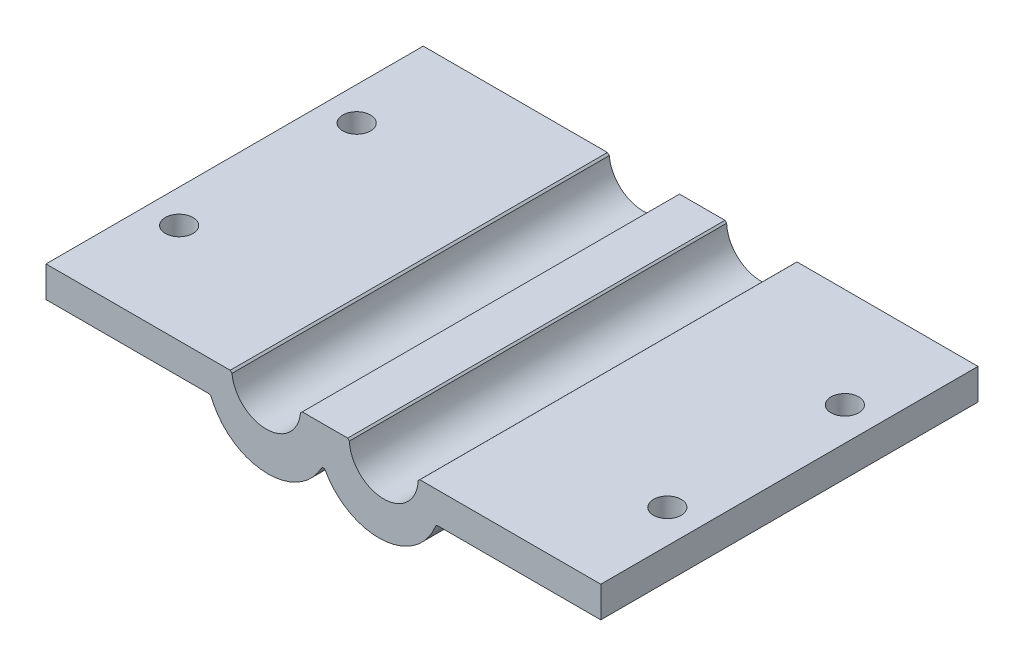
ISO-10303-21;
HEADER;
FILE_DESCRIPTION(('STEP AP214'),'2;1');
FILE_NAME('part.step','',(''),(''),'','','');
FILE_SCHEMA(('AUTOMOTIVE_DESIGN { 1 0 10303 214 1 1 1 1 }'));
ENDSEC;
DATA;
#1=APPLICATION_CONTEXT('core data for automotive mechanical design processes');
#2=APPLICATION_PROTOCOL_DEFINITION('international standard','automotive_design',2000,#1);
#3=PRODUCT_CONTEXT('',#1,'mechanical');
#4=PRODUCT('Part','Part','',(#3));
#5=PRODUCT_RELATED_PRODUCT_CATEGORY('part','',(#4));
#6=PRODUCT_DEFINITION_FORMATION('','',#4);
#7=PRODUCT_DEFINITION_CONTEXT('part definition',#1,'design');
#8=PRODUCT_DEFINITION('design','',#6,#7);
#9=PRODUCT_DEFINITION_SHAPE('','',#8);
#10=(LENGTH_UNIT() NAMED_UNIT(*) SI_UNIT(.MILLI.,.METRE.));
#11=(NAMED_UNIT(*) PLANE_ANGLE_UNIT() SI_UNIT($,.RADIAN.));
#12=(NAMED_UNIT(*) SI_UNIT($,.STERADIAN.) SOLID_ANGLE_UNIT());
#13=UNCERTAINTY_MEASURE_WITH_UNIT(LENGTH_MEASURE(1.E-05),#10,'distance_accuracy_value','');
#14=(GEOMETRIC_REPRESENTATION_CONTEXT(3) GLOBAL_UNCERTAINTY_ASSIGNED_CONTEXT((#13)) GLOBAL_UNIT_ASSIGNED_CONTEXT((#10,
#11,#12)) REPRESENTATION_CONTEXT('',''));
#15=CARTESIAN_POINT('',(0.,0.,0.));
#16=DIRECTION('',(0.,0.,1.));
#17=DIRECTION('',(1.,0.,0.));
#18=AXIS2_PLACEMENT_3D('',#15,#16,#17);
#19=CARTESIAN_POINT('',(-25.,3.,17.));
#20=DIRECTION('',(0.,0.,-1.));
#21=DIRECTION('',(-1.,0.,0.));
#22=AXIS2_PLACEMENT_3D('',#19,#20,#21);
#23=PLANE('',#22);
#24=CARTESIAN_POINT('',(-5.14997765062478,2.91454889852003,17.));
#25=DIRECTION('',(0.,0.,-1.));
#26=DIRECTION('',(-1.,0.,0.));
#27=AXIS2_PLACEMENT_3D('',#24,#25,#26);
#28=CIRCLE('',#27,3.1);
#29=CARTESIAN_POINT('',(-2.06342243598436,2.62614482958895,17.));
#30=VERTEX_POINT('',#29);
#31=CARTESIAN_POINT('',(-8.23653286526521,2.62614482958897,17.));
#32=VERTEX_POINT('',#31);
#33=EDGE_CURVE('E271',#30,#32,#28,.T.);
#34=ORIENTED_EDGE('',*,*,#33,.T.);
#35=DIRECTION('',(-0.70710678118657,0.707106781186525,0.));
#36=VECTOR('',#35,1.);
#37=CARTESIAN_POINT('',(-8.23653286526521,2.62614482958897,17.));
#38=LINE('',#37,#36);
#39=CARTESIAN_POINT('',(-8.39735102760725,2.786962991931,17.));
#40=VERTEX_POINT('',#39);
#41=EDGE_CURVE('E314',#32,#40,#38,.T.);
#42=ORIENTED_EDGE('',*,*,#41,.T.);
#43=DIRECTION('',(-1.,0.,0.));
#44=VECTOR('',#43,1.);
#45=CARTESIAN_POINT('',(-25.,2.786962991931,17.));
#46=LINE('',#45,#44);
#47=CARTESIAN_POINT('',(-25.,2.786962991931,17.));
#48=VERTEX_POINT('',#47);
#49=EDGE_CURVE('E343',#40,#48,#46,.T.);
#50=ORIENTED_EDGE('',*,*,#49,.T.);
#51=DIRECTION('',(0.,-1.,0.));
#52=VECTOR('',#51,1.);
#53=CARTESIAN_POINT('',(-25.,3.,17.));
#54=LINE('',#53,#52);
#55=CARTESIAN_POINT('',(-25.,0.,17.));
#56=VERTEX_POINT('',#55);
#57=EDGE_CURVE('E228',#48,#56,#54,.T.);
#58=ORIENTED_EDGE('',*,*,#57,.T.);
#59=DIRECTION('',(1.,0.,0.));
#60=VECTOR('',#59,1.);
#61=CARTESIAN_POINT('',(-25.,0.,17.));
#62=LINE('',#61,#60);
#63=CARTESIAN_POINT('',(-10.3006575169956,0.,17.));
#64=VERTEX_POINT('',#63);
#65=EDGE_CURVE('E217',#56,#64,#62,.T.);
#66=ORIENTED_EDGE('',*,*,#65,.T.);
#67=CARTESIAN_POINT('',(-10.3006575169956,-0.2,17.));
#68=DIRECTION('',(0.,0.,-1.));
#69=DIRECTION('',(-1.,0.,0.));
#70=AXIS2_PLACEMENT_3D('',#67,#68,#69);
#71=CIRCLE('',#70,0.2);
#72=CARTESIAN_POINT('',(-10.1146695339431,-0.126457698159005,17.));
#73=VERTEX_POINT('',#72);
#74=EDGE_CURVE('E227',#64,#73,#71,.T.);
#75=ORIENTED_EDGE('',*,*,#74,.T.);
#76=CARTESIAN_POINT('',(-5.,1.89595560246837,17.));
#77=DIRECTION('',(0.,0.,1.));
#78=DIRECTION('',(-1.,0.,0.));
#79=AXIS2_PLACEMENT_3D('',#76,#77,#78);
#80=CIRCLE('',#79,5.5);
#81=CARTESIAN_POINT('',(-0.175438596491227,-0.744803239942928,17.));
#82=VERTEX_POINT('',#81);
#83=EDGE_CURVE('E259',#73,#82,#80,.T.);
#84=ORIENTED_EDGE('',*,*,#83,.T.);
#85=CARTESIAN_POINT('',(0.,-0.840830834212431,17.));
#86=DIRECTION('',(0.,0.,-1.));
#87=DIRECTION('',(-1.,0.,0.));
#88=AXIS2_PLACEMENT_3D('',#85,#86,#87);
#89=CIRCLE('',#88,0.2);
#90=CARTESIAN_POINT('',(0.175438596491228,-0.744803239942929,17.));
#91=VERTEX_POINT('',#90);
#92=EDGE_CURVE('E255',#82,#91,#89,.T.);
#93=ORIENTED_EDGE('',*,*,#92,.T.);
#94=CARTESIAN_POINT('',(5.,1.89595560246837,17.));
#95=DIRECTION('',(0.,0.,1.));
#96=DIRECTION('',(1.,0.,0.));
#97=AXIS2_PLACEMENT_3D('',#94,#95,#96);
#98=CIRCLE('',#97,5.5);
#99=CARTESIAN_POINT('',(10.1146695339431,-0.126457698159005,17.));
#100=VERTEX_POINT('',#99);
#101=EDGE_CURVE('E258',#91,#100,#98,.T.);
#102=ORIENTED_EDGE('',*,*,#101,.T.);
#103=CARTESIAN_POINT('',(10.3006575169956,-0.2,17.));
#104=DIRECTION('',(0.,0.,-1.));
#105=DIRECTION('',(-1.,0.,0.));
#106=AXIS2_PLACEMENT_3D('',#103,#104,#105);
#107=CIRCLE('',#106,0.2);
#108=CARTESIAN_POINT('',(10.3006575169956,0.,17.));
#109=VERTEX_POINT('',#108);
#110=EDGE_CURVE('E215',#100,#109,#107,.T.);
#111=ORIENTED_EDGE('',*,*,#110,.T.);
#112=CARTESIAN_POINT('',(25.,0.,17.));
#113=VERTEX_POINT('',#112);
#114=EDGE_CURVE('E209',#109,#113,#62,.T.);
#115=ORIENTED_EDGE('',*,*,#114,.T.);
#116=DIRECTION('',(0.,-1.,0.));
#117=VECTOR('',#116,1.);
#118=CARTESIAN_POINT('',(25.,3.,17.));
#119=LINE('',#118,#117);
#120=CARTESIAN_POINT('',(25.,2.786962991931,17.));
#121=VERTEX_POINT('',#120);
#122=EDGE_CURVE('E220',#121,#113,#119,.T.);
#123=ORIENTED_EDGE('',*,*,#122,.F.);
#124=CARTESIAN_POINT('',(8.68962068870659,2.786962991931,17.));
#125=VERTEX_POINT('',#124);
#126=EDGE_CURVE('E190',#121,#125,#46,.T.);
#127=ORIENTED_EDGE('',*,*,#126,.T.);
#128=DIRECTION('',(0.720228376692277,0.693737043415737,0.));
#129=VECTOR('',#128,1.);
#130=CARTESIAN_POINT('',(8.53972595731741,2.64258166630884,17.));
#131=LINE('',#130,#129);
#132=CARTESIAN_POINT('',(8.53972595731741,2.64258166630884,17.));
#133=VERTEX_POINT('',#132);
#134=EDGE_CURVE('E312',#125,#133,#131,.F.);
#135=ORIENTED_EDGE('',*,*,#134,.T.);
#136=CARTESIAN_POINT('',(5.44190150860759,2.75870093678417,17.));
#137=DIRECTION('',(0.,0.,-1.));
#138=DIRECTION('',(-1.,0.,0.));
#139=AXIS2_PLACEMENT_3D('',#136,#137,#138);
#140=CIRCLE('',#139,3.1);
#141=CARTESIAN_POINT('',(2.3443862604072,2.63460707244737,17.));
#142=VERTEX_POINT('',#141);
#143=EDGE_CURVE('E274',#133,#142,#140,.T.);
#144=ORIENTED_EDGE('',*,*,#143,.T.);
#145=DIRECTION('',(-0.707106781186572,0.707106781186523,0.));
#146=VECTOR('',#145,1.);
#147=CARTESIAN_POINT('',(2.3443862604072,2.63460707244736,17.));
#148=LINE('',#147,#146);
#149=CARTESIAN_POINT('',(2.19203034092355,2.786962991931,17.));
#150=VERTEX_POINT('',#149);
#151=EDGE_CURVE('E310',#142,#150,#148,.T.);
#152=ORIENTED_EDGE('',*,*,#151,.T.);
#153=CARTESIAN_POINT('',(-1.9026042736423,2.786962991931,17.));
#154=VERTEX_POINT('',#153);
#155=EDGE_CURVE('E337',#150,#154,#46,.T.);
#156=ORIENTED_EDGE('',*,*,#155,.T.);
#157=DIRECTION('',(0.707106781186553,0.707106781186542,0.));
#158=VECTOR('',#157,1.);
#159=CARTESIAN_POINT('',(-2.06342243598436,2.62614482958895,17.));
#160=LINE('',#159,#158);
#161=EDGE_CURVE('E308',#154,#30,#160,.F.);
#162=ORIENTED_EDGE('',*,*,#161,.T.);
#163=EDGE_LOOP('',(#34,#42,#50,#58,#66,#75,#84,#93,#102,#111,#115,#123,#127,#135,#144,#152,#156,#162));
#164=FACE_BOUND('',#163,.T.);
#165=ADVANCED_FACE('F36',(#164),#23,.F.);
#166=CARTESIAN_POINT('',(-25.,3.,-17.));
#167=DIRECTION('',(0.,0.,1.));
#168=DIRECTION('',(1.,0.,0.));
#169=AXIS2_PLACEMENT_3D('',#166,#167,#168);
#170=PLANE('',#169);
#171=DIRECTION('',(-1.,0.,0.));
#172=VECTOR('',#171,1.);
#173=CARTESIAN_POINT('',(-25.,2.786962991931,-17.));
#174=LINE('',#173,#172);
#175=CARTESIAN_POINT('',(-8.39735102760726,2.78696299193101,-17.));
#176=VERTEX_POINT('',#175);
#177=CARTESIAN_POINT('',(-25.,2.786962991931,-17.));
#178=VERTEX_POINT('',#177);
#179=EDGE_CURVE('E203',#176,#178,#174,.T.);
#180=ORIENTED_EDGE('',*,*,#179,.F.);
#181=DIRECTION('',(0.70710678118657,-0.707106781186525,0.));
#182=VECTOR('',#181,1.);
#183=CARTESIAN_POINT('',(-8.23653286526521,2.62614482958897,-17.));
#184=LINE('',#183,#182);
#185=CARTESIAN_POINT('',(-8.23653286526521,2.62614482958897,-17.));
#186=VERTEX_POINT('',#185);
#187=EDGE_CURVE('E322',#176,#186,#184,.T.);
#188=ORIENTED_EDGE('',*,*,#187,.T.);
#189=CARTESIAN_POINT('',(-5.14997765062478,2.91454889852003,-17.));
#190=DIRECTION('',(0.,0.,-1.));
#191=DIRECTION('',(-1.,0.,0.));
#192=AXIS2_PLACEMENT_3D('',#189,#190,#191);
#193=CIRCLE('',#192,3.1);
#194=CARTESIAN_POINT('',(-2.06342243598436,2.62614482958895,-17.));
#195=VERTEX_POINT('',#194);
#196=EDGE_CURVE('E281',#195,#186,#193,.T.);
#197=ORIENTED_EDGE('',*,*,#196,.F.);
#198=DIRECTION('',(-0.707106781186553,-0.707106781186542,0.));
#199=VECTOR('',#198,1.);
#200=CARTESIAN_POINT('',(-2.06342243598436,2.62614482958895,-17.));
#201=LINE('',#200,#199);
#202=CARTESIAN_POINT('',(-1.9026042736423,2.786962991931,-17.));
#203=VERTEX_POINT('',#202);
#204=EDGE_CURVE('E318',#195,#203,#201,.F.);
#205=ORIENTED_EDGE('',*,*,#204,.T.);
#206=CARTESIAN_POINT('',(2.19203034092355,2.786962991931,-17.));
#207=VERTEX_POINT('',#206);
#208=EDGE_CURVE('E201',#207,#203,#174,.T.);
#209=ORIENTED_EDGE('',*,*,#208,.F.);
#210=DIRECTION('',(0.707106781186572,-0.707106781186523,0.));
#211=VECTOR('',#210,1.);
#212=CARTESIAN_POINT('',(2.3443862604072,2.63460707244736,-17.));
#213=LINE('',#212,#211);
#214=CARTESIAN_POINT('',(2.3443862604072,2.63460707244737,-17.));
#215=VERTEX_POINT('',#214);
#216=EDGE_CURVE('E57',#207,#215,#213,.T.);
#217=ORIENTED_EDGE('',*,*,#216,.T.);
#218=CARTESIAN_POINT('',(5.44190150860759,2.75870093678417,-17.));
#219=DIRECTION('',(0.,0.,-1.));
#220=DIRECTION('',(-1.,0.,0.));
#221=AXIS2_PLACEMENT_3D('',#218,#219,#220);
#222=CIRCLE('',#221,3.1);
#223=CARTESIAN_POINT('',(8.53972595731741,2.64258166630884,-17.));
#224=VERTEX_POINT('',#223);
#225=EDGE_CURVE('E278',#224,#215,#222,.T.);
#226=ORIENTED_EDGE('',*,*,#225,.F.);
#227=DIRECTION('',(-0.720228376692277,-0.693737043415737,0.));
#228=VECTOR('',#227,1.);
#229=CARTESIAN_POINT('',(8.53972595731741,2.64258166630884,-17.));
#230=LINE('',#229,#228);
#231=CARTESIAN_POINT('',(8.68962068870659,2.786962991931,-17.));
#232=VERTEX_POINT('',#231);
#233=EDGE_CURVE('E51',#224,#232,#230,.F.);
#234=ORIENTED_EDGE('',*,*,#233,.T.);
#235=CARTESIAN_POINT('',(25.,2.786962991931,-17.));
#236=VERTEX_POINT('',#235);
#237=EDGE_CURVE('E187',#236,#232,#174,.T.);
#238=ORIENTED_EDGE('',*,*,#237,.F.);
#239=DIRECTION('',(0.,-1.,0.));
#240=VECTOR('',#239,1.);
#241=CARTESIAN_POINT('',(25.,3.,-17.));
#242=LINE('',#241,#240);
#243=CARTESIAN_POINT('',(25.,0.,-17.));
#244=VERTEX_POINT('',#243);
#245=EDGE_CURVE('E199',#236,#244,#242,.T.);
#246=ORIENTED_EDGE('',*,*,#245,.T.);
#247=DIRECTION('',(-1.,0.,0.));
#248=VECTOR('',#247,1.);
#249=CARTESIAN_POINT('',(-25.,0.,-17.));
#250=LINE('',#249,#248);
#251=CARTESIAN_POINT('',(10.3006575169956,0.,-17.));
#252=VERTEX_POINT('',#251);
#253=EDGE_CURVE('E208',#244,#252,#250,.T.);
#254=ORIENTED_EDGE('',*,*,#253,.T.);
#255=CARTESIAN_POINT('',(10.3006575169956,-0.2,-17.));
#256=DIRECTION('',(0.,0.,1.));
#257=DIRECTION('',(1.,0.,0.));
#258=AXIS2_PLACEMENT_3D('',#255,#256,#257);
#259=CIRCLE('',#258,0.2);
#260=CARTESIAN_POINT('',(10.1146695339431,-0.126457698159005,-17.));
#261=VERTEX_POINT('',#260);
#262=EDGE_CURVE('E211',#252,#261,#259,.T.);
#263=ORIENTED_EDGE('',*,*,#262,.T.);
#264=CARTESIAN_POINT('',(5.,1.89595560246837,-17.));
#265=DIRECTION('',(0.,0.,1.));
#266=DIRECTION('',(1.,0.,0.));
#267=AXIS2_PLACEMENT_3D('',#264,#265,#266);
#268=CIRCLE('',#267,5.5);
#269=CARTESIAN_POINT('',(0.175438596491228,-0.744803239942929,-17.));
#270=VERTEX_POINT('',#269);
#271=EDGE_CURVE('E263',#261,#270,#268,.F.);
#272=ORIENTED_EDGE('',*,*,#271,.T.);
#273=CARTESIAN_POINT('',(0.,-0.840830834212431,-17.));
#274=DIRECTION('',(0.,0.,1.));
#275=DIRECTION('',(1.,0.,0.));
#276=AXIS2_PLACEMENT_3D('',#273,#274,#275);
#277=CIRCLE('',#276,0.2);
#278=CARTESIAN_POINT('',(-0.175438596491227,-0.744803239942928,-17.));
#279=VERTEX_POINT('',#278);
#280=EDGE_CURVE('E265',#270,#279,#277,.T.);
#281=ORIENTED_EDGE('',*,*,#280,.T.);
#282=CARTESIAN_POINT('',(-5.,1.89595560246837,-17.));
#283=DIRECTION('',(0.,0.,1.));
#284=DIRECTION('',(1.,0.,0.));
#285=AXIS2_PLACEMENT_3D('',#282,#283,#284);
#286=CIRCLE('',#285,5.5);
#287=CARTESIAN_POINT('',(-10.1146695339431,-0.126457698159005,-17.));
#288=VERTEX_POINT('',#287);
#289=EDGE_CURVE('E267',#279,#288,#286,.F.);
#290=ORIENTED_EDGE('',*,*,#289,.T.);
#291=CARTESIAN_POINT('',(-10.3006575169956,-0.2,-17.));
#292=DIRECTION('',(0.,0.,1.));
#293=DIRECTION('',(1.,0.,0.));
#294=AXIS2_PLACEMENT_3D('',#291,#292,#293);
#295=CIRCLE('',#294,0.2);
#296=CARTESIAN_POINT('',(-10.3006575169956,0.,-17.));
#297=VERTEX_POINT('',#296);
#298=EDGE_CURVE('E270',#288,#297,#295,.T.);
#299=ORIENTED_EDGE('',*,*,#298,.T.);
#300=CARTESIAN_POINT('',(-25.,0.,-17.));
#301=VERTEX_POINT('',#300);
#302=EDGE_CURVE('E213',#297,#301,#250,.T.);
#303=ORIENTED_EDGE('',*,*,#302,.T.);
#304=DIRECTION('',(0.,-1.,0.));
#305=VECTOR('',#304,1.);
#306=CARTESIAN_POINT('',(-25.,3.,-17.));
#307=LINE('',#306,#305);
#308=EDGE_CURVE('E222',#178,#301,#307,.T.);
#309=ORIENTED_EDGE('',*,*,#308,.F.);
#310=EDGE_LOOP('',(#180,#188,#197,#205,#209,#217,#226,#234,#238,#246,#254,#263,#272,#281,#290,
#299,#303,#309));
#311=FACE_BOUND('',#310,.T.);
#312=ADVANCED_FACE('F197',(#311),#170,.F.);
#313=CARTESIAN_POINT('',(0.,-0.840830834212431,-37.642815516187));
#314=DIRECTION('',(0.,0.,1.));
#315=DIRECTION('',(1.,0.,0.));
#316=AXIS2_PLACEMENT_3D('',#313,#314,#315);
#317=CYLINDRICAL_SURFACE('',#316,0.2);
#318=CARTESIAN_POINT('',(0.,-0.840830834212431,3.5));
#319=DIRECTION('',(0.,0.,1.));
#320=DIRECTION('',(0.,-1.,0.));
#321=AXIS2_PLACEMENT_3D('',#318,#319,#320);
#322=CIRCLE('',#321,0.2);
#323=CARTESIAN_POINT('',(0.175438596491228,-0.744803239942929,3.5));
#324=VERTEX_POINT('',#323);
#325=CARTESIAN_POINT('',(-0.175438596491227,-0.744803239942928,3.5));
#326=VERTEX_POINT('',#325);
#327=EDGE_CURVE('E285',#324,#326,#322,.T.);
#328=ORIENTED_EDGE('',*,*,#327,.F.);
#329=DIRECTION('',(0.,0.,1.));
#330=VECTOR('',#329,1.);
#331=CARTESIAN_POINT('',(0.175438596491228,-0.744803239942929,-37.642815516187));
#332=LINE('',#331,#330);
#333=EDGE_CURVE('E236',#324,#91,#332,.T.);
#334=ORIENTED_EDGE('',*,*,#333,.T.);
#335=ORIENTED_EDGE('',*,*,#92,.F.);
#336=DIRECTION('',(0.,0.,1.));
#337=VECTOR('',#336,1.);
#338=CARTESIAN_POINT('',(-0.175438596491227,-0.744803239942928,-37.642815516187));
#339=LINE('',#338,#337);
#340=EDGE_CURVE('E249',#326,#82,#339,.T.);
#341=ORIENTED_EDGE('',*,*,#340,.F.);
#342=EDGE_LOOP('',(#328,#334,#335,#341));
#343=FACE_BOUND('',#342,.T.);
#344=ADVANCED_FACE('F423',(#343),#317,.F.);
#345=CARTESIAN_POINT('',(0.,0.,0.));
#346=DIRECTION('',(0.,1.,0.));
#347=DIRECTION('',(0.,0.,1.));
#348=AXIS2_PLACEMENT_3D('',#345,#346,#347);
#349=PLANE('',#348);
#350=CARTESIAN_POINT('',(22.,0.,-8.));
#351=DIRECTION('',(0.,1.,0.));
#352=DIRECTION('',(0.,0.,1.));
#353=AXIS2_PLACEMENT_3D('',#350,#351,#352);
#354=CIRCLE('',#353,1.25);
#355=CARTESIAN_POINT('',(22.,0.,-6.75));
#356=VERTEX_POINT('',#355);
#357=EDGE_CURVE('E232',#356,#356,#354,.T.);
#358=ORIENTED_EDGE('',*,*,#357,.T.);
#359=EDGE_LOOP('',(#358));
#360=FACE_BOUND('',#359,.T.);
#361=CARTESIAN_POINT('',(22.,0.,8.));
#362=DIRECTION('',(0.,1.,0.));
#363=DIRECTION('',(0.,0.,-1.));
#364=AXIS2_PLACEMENT_3D('',#361,#362,#363);
#365=CIRCLE('',#364,1.25);
#366=CARTESIAN_POINT('',(22.,0.,6.75));
#367=VERTEX_POINT('',#366);
#368=EDGE_CURVE('E235',#367,#367,#365,.T.);
#369=ORIENTED_EDGE('',*,*,#368,.T.);
#370=EDGE_LOOP('',(#369));
#371=FACE_BOUND('',#370,.T.);
#372=ORIENTED_EDGE('',*,*,#114,.F.);
#373=DIRECTION('',(0.,0.,1.));
#374=VECTOR('',#373,1.);
#375=CARTESIAN_POINT('',(10.3006575169956,0.,0.));
#376=LINE('',#375,#374);
#377=EDGE_CURVE('E231',#109,#252,#376,.F.);
#378=ORIENTED_EDGE('',*,*,#377,.T.);
#379=ORIENTED_EDGE('',*,*,#253,.F.);
#380=DIRECTION('',(0.,0.,-1.));
#381=VECTOR('',#380,1.);
#382=CARTESIAN_POINT('',(25.,0.,-17.));
#383=LINE('',#382,#381);
#384=EDGE_CURVE('E206',#113,#244,#383,.T.);
#385=ORIENTED_EDGE('',*,*,#384,.F.);
#386=EDGE_LOOP('',(#372,#378,#379,#385));
#387=FACE_BOUND('',#386,.T.);
#388=ADVANCED_FACE('F493',(#360,#371,#387),#349,.F.);
#389=CARTESIAN_POINT('',(-25.,3.,-17.));
#390=DIRECTION('',(1.,0.,0.));
#391=DIRECTION('',(0.,0.,-1.));
#392=AXIS2_PLACEMENT_3D('',#389,#390,#391);
#393=PLANE('',#392);
#394=ORIENTED_EDGE('',*,*,#57,.F.);
#395=DIRECTION('',(0.,0.,-1.));
#396=VECTOR('',#395,1.);
#397=CARTESIAN_POINT('',(-25.,2.786962991931,17.00005));
#398=LINE('',#397,#396);
#399=EDGE_CURVE('E194',#48,#178,#398,.T.);
#400=ORIENTED_EDGE('',*,*,#399,.T.);
#401=ORIENTED_EDGE('',*,*,#308,.T.);
#402=DIRECTION('',(0.,0.,1.));
#403=VECTOR('',#402,1.);
#404=CARTESIAN_POINT('',(-25.,0.,-17.));
#405=LINE('',#404,#403);
#406=EDGE_CURVE('E223',#301,#56,#405,.T.);
#407=ORIENTED_EDGE('',*,*,#406,.T.);
#408=EDGE_LOOP('',(#394,#400,#401,#407));
#409=FACE_BOUND('',#408,.T.);
#410=ADVANCED_FACE('F369',(#409),#393,.F.);
#411=CARTESIAN_POINT('',(25.,3.,-17.));
#412=DIRECTION('',(-1.,0.,0.));
#413=DIRECTION('',(0.,0.,1.));
#414=AXIS2_PLACEMENT_3D('',#411,#412,#413);
#415=PLANE('',#414);
#416=ORIENTED_EDGE('',*,*,#245,.F.);
#417=DIRECTION('',(0.,0.,-1.));
#418=VECTOR('',#417,1.);
#419=CARTESIAN_POINT('',(25.,2.786962991931,17.00005));
#420=LINE('',#419,#418);
#421=EDGE_CURVE('E184',#121,#236,#420,.T.);
#422=ORIENTED_EDGE('',*,*,#421,.F.);
#423=ORIENTED_EDGE('',*,*,#122,.T.);
#424=ORIENTED_EDGE('',*,*,#384,.T.);
#425=EDGE_LOOP('',(#416,#422,#423,#424));
#426=FACE_BOUND('',#425,.T.);
#427=ADVANCED_FACE('F204',(#426),#415,.F.);
#428=CARTESIAN_POINT('',(-22.,0.,-8.));
#429=DIRECTION('',(0.,1.,0.));
#430=DIRECTION('',(0.,0.,-1.));
#431=AXIS2_PLACEMENT_3D('',#428,#429,#430);
#432=CIRCLE('',#431,1.25);
#433=CARTESIAN_POINT('',(-22.,0.,-9.25));
#434=VERTEX_POINT('',#433);
#435=EDGE_CURVE('E243',#434,#434,#432,.T.);
#436=ORIENTED_EDGE('',*,*,#435,.T.);
#437=EDGE_LOOP('',(#436));
#438=FACE_BOUND('',#437,.T.);
#439=CARTESIAN_POINT('',(-22.,0.,8.));
#440=DIRECTION('',(0.,1.,0.));
#441=DIRECTION('',(0.,0.,1.));
#442=AXIS2_PLACEMENT_3D('',#439,#440,#441);
#443=CIRCLE('',#442,1.25);
#444=CARTESIAN_POINT('',(-22.,0.,9.25));
#445=VERTEX_POINT('',#444);
#446=EDGE_CURVE('E239',#445,#445,#443,.T.);
#447=ORIENTED_EDGE('',*,*,#446,.T.);
#448=EDGE_LOOP('',(#447));
#449=FACE_BOUND('',#448,.T.);
#450=ORIENTED_EDGE('',*,*,#302,.F.);
#451=DIRECTION('',(0.,0.,1.));
#452=VECTOR('',#451,1.);
#453=CARTESIAN_POINT('',(-10.3006575169956,0.,0.));
#454=LINE('',#453,#452);
#455=EDGE_CURVE('E242',#297,#64,#454,.T.);
#456=ORIENTED_EDGE('',*,*,#455,.T.);
#457=ORIENTED_EDGE('',*,*,#65,.F.);
#458=ORIENTED_EDGE('',*,*,#406,.F.);
#459=EDGE_LOOP('',(#450,#456,#457,#458));
#460=FACE_BOUND('',#459,.T.);
#461=ADVANCED_FACE('F378',(#438,#449,#460),#349,.F.);
#462=CARTESIAN_POINT('',(22.,0.,-8.));
#463=DIRECTION('',(0.,1.,0.));
#464=DIRECTION('',(0.,0.,1.));
#465=AXIS2_PLACEMENT_3D('',#462,#463,#464);
#466=CYLINDRICAL_SURFACE('',#465,1.25);
#467=CARTESIAN_POINT('',(22.,2.786962991931,-8.));
#468=DIRECTION('',(0.,-1.,0.));
#469=DIRECTION('',(0.,0.,-1.));
#470=AXIS2_PLACEMENT_3D('',#467,#468,#469);
#471=CIRCLE('',#470,1.25);
#472=CARTESIAN_POINT('',(22.,2.786962991931,-9.25));
#473=VERTEX_POINT('',#472);
#474=EDGE_CURVE('E277',#473,#473,#471,.F.);
#475=ORIENTED_EDGE('',*,*,#474,.T.);
#476=EDGE_LOOP('',(#475));
#477=FACE_BOUND('',#476,.T.);
#478=ORIENTED_EDGE('',*,*,#357,.F.);
#479=EDGE_LOOP('',(#478));
#480=FACE_BOUND('',#479,.T.);
#481=ADVANCED_FACE('F506',(#477,#480),#466,.F.);
#482=CARTESIAN_POINT('',(22.,0.,8.));
#483=DIRECTION('',(0.,1.,0.));
#484=DIRECTION('',(0.,0.,1.));
#485=AXIS2_PLACEMENT_3D('',#482,#483,#484);
#486=CYLINDRICAL_SURFACE('',#485,1.25);
#487=CARTESIAN_POINT('',(22.,2.786962991931,8.));
#488=DIRECTION('',(0.,-1.,0.));
#489=DIRECTION('',(0.,0.,-1.));
#490=AXIS2_PLACEMENT_3D('',#487,#488,#489);
#491=CIRCLE('',#490,1.25);
#492=CARTESIAN_POINT('',(22.,2.786962991931,6.75));
#493=VERTEX_POINT('',#492);
#494=EDGE_CURVE('E396',#493,#493,#491,.F.);
#495=ORIENTED_EDGE('',*,*,#494,.T.);
#496=EDGE_LOOP('',(#495));
#497=FACE_BOUND('',#496,.T.);
#498=ORIENTED_EDGE('',*,*,#368,.F.);
#499=EDGE_LOOP('',(#498));
#500=FACE_BOUND('',#499,.T.);
#501=ADVANCED_FACE('F512',(#497,#500),#486,.F.);
#502=CARTESIAN_POINT('',(-22.,0.,8.));
#503=DIRECTION('',(0.,1.,0.));
#504=DIRECTION('',(0.,0.,1.));
#505=AXIS2_PLACEMENT_3D('',#502,#503,#504);
#506=CYLINDRICAL_SURFACE('',#505,1.25);
#507=CARTESIAN_POINT('',(-22.,2.786962991931,8.));
#508=DIRECTION('',(0.,-1.,0.));
#509=DIRECTION('',(0.,0.,-1.));
#510=AXIS2_PLACEMENT_3D('',#507,#508,#509);
#511=CIRCLE('',#510,1.25);
#512=CARTESIAN_POINT('',(-22.,2.786962991931,6.75));
#513=VERTEX_POINT('',#512);
#514=EDGE_CURVE('E364',#513,#513,#511,.F.);
#515=ORIENTED_EDGE('',*,*,#514,.T.);
#516=EDGE_LOOP('',(#515));
#517=FACE_BOUND('',#516,.T.);
#518=ORIENTED_EDGE('',*,*,#446,.F.);
#519=EDGE_LOOP('',(#518));
#520=FACE_BOUND('',#519,.T.);
#521=ADVANCED_FACE('F402',(#517,#520),#506,.F.);
#522=CARTESIAN_POINT('',(-22.,0.,-8.));
#523=DIRECTION('',(0.,1.,0.));
#524=DIRECTION('',(0.,0.,1.));
#525=AXIS2_PLACEMENT_3D('',#522,#523,#524);
#526=CYLINDRICAL_SURFACE('',#525,1.25);
#527=CARTESIAN_POINT('',(-22.,2.786962991931,-8.));
#528=DIRECTION('',(0.,-1.,0.));
#529=DIRECTION('',(0.,0.,-1.));
#530=AXIS2_PLACEMENT_3D('',#527,#528,#529);
#531=CIRCLE('',#530,1.25);
#532=CARTESIAN_POINT('',(-22.,2.786962991931,-9.25));
#533=VERTEX_POINT('',#532);
#534=EDGE_CURVE('E362',#533,#533,#531,.F.);
#535=ORIENTED_EDGE('',*,*,#534,.T.);
#536=EDGE_LOOP('',(#535));
#537=FACE_BOUND('',#536,.T.);
#538=ORIENTED_EDGE('',*,*,#435,.F.);
#539=EDGE_LOOP('',(#538));
#540=FACE_BOUND('',#539,.T.);
#541=ADVANCED_FACE('F518',(#537,#540),#526,.F.);
#542=CARTESIAN_POINT('',(5.,1.89595560246837,-37.642815516187));
#543=DIRECTION('',(0.,0.,1.));
#544=DIRECTION('',(1.,0.,0.));
#545=AXIS2_PLACEMENT_3D('',#542,#543,#544);
#546=CYLINDRICAL_SURFACE('',#545,5.5);
#547=ORIENTED_EDGE('',*,*,#271,.F.);
#548=DIRECTION('',(0.,0.,1.));
#549=VECTOR('',#548,1.);
#550=CARTESIAN_POINT('',(10.1146695339431,-0.126457698159005,-37.642815516187));
#551=LINE('',#550,#549);
#552=EDGE_CURVE('E254',#261,#100,#551,.T.);
#553=ORIENTED_EDGE('',*,*,#552,.T.);
#554=ORIENTED_EDGE('',*,*,#101,.F.);
#555=ORIENTED_EDGE('',*,*,#333,.F.);
#556=CARTESIAN_POINT('',(5.,1.89595560246837,3.5));
#557=DIRECTION('',(0.,0.,1.));
#558=DIRECTION('',(0.,-1.,0.));
#559=AXIS2_PLACEMENT_3D('',#556,#557,#558);
#560=CIRCLE('',#559,5.5);
#561=CARTESIAN_POINT('',(9.91319864333387,-0.575982724258701,3.5));
#562=VERTEX_POINT('',#561);
#563=EDGE_CURVE('E280',#562,#324,#560,.F.);
#564=ORIENTED_EDGE('',*,*,#563,.F.);
#565=DIRECTION('',(0.,0.,1.));
#566=VECTOR('',#565,1.);
#567=CARTESIAN_POINT('',(9.91319864333387,-0.575982724258701,-37.642815516187));
#568=LINE('',#567,#566);
#569=CARTESIAN_POINT('',(9.91319864333387,-0.575982724258701,-3.5));
#570=VERTEX_POINT('',#569);
#571=EDGE_CURVE('E288',#570,#562,#568,.T.);
#572=ORIENTED_EDGE('',*,*,#571,.F.);
#573=CARTESIAN_POINT('',(5.,1.89595560246837,-3.5));
#574=DIRECTION('',(0.,0.,-1.));
#575=DIRECTION('',(0.,1.,0.));
#576=AXIS2_PLACEMENT_3D('',#573,#574,#575);
#577=CIRCLE('',#576,5.5);
#578=CARTESIAN_POINT('',(0.175438596491228,-0.744803239942929,-3.5));
#579=VERTEX_POINT('',#578);
#580=EDGE_CURVE('E292',#579,#570,#577,.F.);
#581=ORIENTED_EDGE('',*,*,#580,.F.);
#582=EDGE_CURVE('E251',#270,#579,#332,.T.);
#583=ORIENTED_EDGE('',*,*,#582,.F.);
#584=EDGE_LOOP('',(#547,#553,#554,#555,#564,#572,#581,#583));
#585=FACE_BOUND('',#584,.T.);
#586=ADVANCED_FACE('F472',(#585),#546,.T.);
#587=CARTESIAN_POINT('',(0.,-0.840830834212431,-3.5));
#588=DIRECTION('',(0.,0.,-1.));
#589=DIRECTION('',(0.,1.,0.));
#590=AXIS2_PLACEMENT_3D('',#587,#588,#589);
#591=CIRCLE('',#590,0.2);
#592=CARTESIAN_POINT('',(-0.175438596491227,-0.744803239942928,-3.5));
#593=VERTEX_POINT('',#592);
#594=EDGE_CURVE('E296',#593,#579,#591,.T.);
#595=ORIENTED_EDGE('',*,*,#594,.F.);
#596=EDGE_CURVE('E246',#279,#593,#339,.T.);
#597=ORIENTED_EDGE('',*,*,#596,.F.);
#598=ORIENTED_EDGE('',*,*,#280,.F.);
#599=ORIENTED_EDGE('',*,*,#582,.T.);
#600=EDGE_LOOP('',(#595,#597,#598,#599));
#601=FACE_BOUND('',#600,.T.);
#602=ADVANCED_FACE('F484',(#601),#317,.F.);
#603=CARTESIAN_POINT('',(-5.,1.89595560246837,-37.642815516187));
#604=DIRECTION('',(0.,0.,1.));
#605=DIRECTION('',(1.,0.,0.));
#606=AXIS2_PLACEMENT_3D('',#603,#604,#605);
#607=CYLINDRICAL_SURFACE('',#606,5.5);
#608=ORIENTED_EDGE('',*,*,#83,.F.);
#609=DIRECTION('',(0.,0.,1.));
#610=VECTOR('',#609,1.);
#611=CARTESIAN_POINT('',(-10.1146695339431,-0.126457698159005,-37.642815516187));
#612=LINE('',#611,#610);
#613=EDGE_CURVE('E250',#73,#288,#612,.F.);
#614=ORIENTED_EDGE('',*,*,#613,.T.);
#615=ORIENTED_EDGE('',*,*,#289,.F.);
#616=ORIENTED_EDGE('',*,*,#596,.T.);
#617=CARTESIAN_POINT('',(-5.,1.89595560246837,-3.5));
#618=DIRECTION('',(0.,0.,-1.));
#619=DIRECTION('',(0.,1.,0.));
#620=AXIS2_PLACEMENT_3D('',#617,#618,#619);
#621=CIRCLE('',#620,5.5);
#622=CARTESIAN_POINT('',(-9.91319864333387,-0.575982724258701,-3.5));
#623=VERTEX_POINT('',#622);
#624=EDGE_CURVE('E294',#623,#593,#621,.F.);
#625=ORIENTED_EDGE('',*,*,#624,.F.);
#626=DIRECTION('',(0.,0.,1.));
#627=VECTOR('',#626,1.);
#628=CARTESIAN_POINT('',(-9.91319864333387,-0.575982724258701,-37.642815516187));
#629=LINE('',#628,#627);
#630=CARTESIAN_POINT('',(-9.91319864333387,-0.575982724258701,3.5));
#631=VERTEX_POINT('',#630);
#632=EDGE_CURVE('E290',#631,#623,#629,.F.);
#633=ORIENTED_EDGE('',*,*,#632,.F.);
#634=CARTESIAN_POINT('',(-5.,1.89595560246837,3.5));
#635=DIRECTION('',(0.,0.,1.));
#636=DIRECTION('',(0.,-1.,0.));
#637=AXIS2_PLACEMENT_3D('',#634,#635,#636);
#638=CIRCLE('',#637,5.5);
#639=EDGE_CURVE('E287',#326,#631,#638,.F.);
#640=ORIENTED_EDGE('',*,*,#639,.F.);
#641=ORIENTED_EDGE('',*,*,#340,.T.);
#642=EDGE_LOOP('',(#608,#614,#615,#616,#625,#633,#640,#641));
#643=FACE_BOUND('',#642,.T.);
#644=ADVANCED_FACE('F450',(#643),#607,.T.);
#645=CARTESIAN_POINT('',(-5.14997765062478,2.91454889852003,17.00005));
#646=DIRECTION('',(0.,0.,-1.));
#647=DIRECTION('',(-1.,0.,0.));
#648=AXIS2_PLACEMENT_3D('',#645,#646,#647);
#649=CYLINDRICAL_SURFACE('',#648,3.1);
#650=ORIENTED_EDGE('',*,*,#196,.T.);
#651=DIRECTION('',(0.,0.,-1.));
#652=VECTOR('',#651,1.);
#653=CARTESIAN_POINT('',(-8.23653286526521,2.62614482958897,17.00005));
#654=LINE('',#653,#652);
#655=EDGE_CURVE('E305',#186,#32,#654,.F.);
#656=ORIENTED_EDGE('',*,*,#655,.T.);
#657=ORIENTED_EDGE('',*,*,#33,.F.);
#658=DIRECTION('',(0.,0.,-1.));
#659=VECTOR('',#658,1.);
#660=CARTESIAN_POINT('',(-2.06342243598436,2.62614482958895,17.00005));
#661=LINE('',#660,#659);
#662=EDGE_CURVE('E298',#30,#195,#661,.T.);
#663=ORIENTED_EDGE('',*,*,#662,.T.);
#664=EDGE_LOOP('',(#650,#656,#657,#663));
#665=FACE_BOUND('',#664,.T.);
#666=ADVANCED_FACE('F348',(#665),#649,.F.);
#667=CARTESIAN_POINT('',(5.44190150860759,2.75870093678417,17.00005));
#668=DIRECTION('',(0.,0.,-1.));
#669=DIRECTION('',(-1.,0.,0.));
#670=AXIS2_PLACEMENT_3D('',#667,#668,#669);
#671=CYLINDRICAL_SURFACE('',#670,3.1);
#672=ORIENTED_EDGE('',*,*,#143,.F.);
#673=DIRECTION('',(0.,0.,-1.));
#674=VECTOR('',#673,1.);
#675=CARTESIAN_POINT('',(8.53972595731741,2.64258166630884,17.00005));
#676=LINE('',#675,#674);
#677=EDGE_CURVE('E327',#133,#224,#676,.T.);
#678=ORIENTED_EDGE('',*,*,#677,.T.);
#679=ORIENTED_EDGE('',*,*,#225,.T.);
#680=DIRECTION('',(0.,0.,-1.));
#681=VECTOR('',#680,1.);
#682=CARTESIAN_POINT('',(2.3443862604072,2.63460707244736,17.00005));
#683=LINE('',#682,#681);
#684=EDGE_CURVE('E324',#215,#142,#683,.F.);
#685=ORIENTED_EDGE('',*,*,#684,.T.);
#686=EDGE_LOOP('',(#672,#678,#679,#685));
#687=FACE_BOUND('',#686,.T.);
#688=ADVANCED_FACE('F438',(#687),#671,.F.);
#689=CARTESIAN_POINT('',(-25.000025,-0.575982724258701,3.5));
#690=DIRECTION('',(0.,0.,1.));
#691=DIRECTION('',(0.,-1.,0.));
#692=AXIS2_PLACEMENT_3D('',#689,#690,#691);
#693=PLANE('',#692);
#694=ORIENTED_EDGE('',*,*,#563,.T.);
#695=ORIENTED_EDGE('',*,*,#327,.T.);
#696=ORIENTED_EDGE('',*,*,#639,.T.);
#697=DIRECTION('',(1.,0.,0.));
#698=VECTOR('',#697,1.);
#699=CARTESIAN_POINT('',(-25.000025,-0.575982724258701,3.5));
#700=LINE('',#699,#698);
#701=EDGE_CURVE('E291',#631,#562,#700,.T.);
#702=ORIENTED_EDGE('',*,*,#701,.T.);
#703=EDGE_LOOP('',(#694,#695,#696,#702));
#704=FACE_BOUND('',#703,.T.);
#705=ADVANCED_FACE('F441',(#704),#693,.F.);
#706=CARTESIAN_POINT('',(-25.000025,-0.575982724258701,3.5));
#707=DIRECTION('',(0.,1.,0.));
#708=DIRECTION('',(0.,0.,1.));
#709=AXIS2_PLACEMENT_3D('',#706,#707,#708);
#710=PLANE('',#709);
#711=ORIENTED_EDGE('',*,*,#571,.T.);
#712=ORIENTED_EDGE('',*,*,#701,.F.);
#713=ORIENTED_EDGE('',*,*,#632,.T.);
#714=DIRECTION('',(1.,0.,0.));
#715=VECTOR('',#714,1.);
#716=CARTESIAN_POINT('',(-25.000025,-0.575982724258701,-3.5));
#717=LINE('',#716,#715);
#718=EDGE_CURVE('E295',#623,#570,#717,.T.);
#719=ORIENTED_EDGE('',*,*,#718,.T.);
#720=EDGE_LOOP('',(#711,#712,#713,#719));
#721=FACE_BOUND('',#720,.T.);
#722=ADVANCED_FACE('F447',(#721),#710,.F.);
#723=CARTESIAN_POINT('',(-25.000025,-0.575982724258701,-3.5));
#724=DIRECTION('',(0.,0.,-1.));
#725=DIRECTION('',(0.,1.,0.));
#726=AXIS2_PLACEMENT_3D('',#723,#724,#725);
#727=PLANE('',#726);
#728=ORIENTED_EDGE('',*,*,#580,.T.);
#729=ORIENTED_EDGE('',*,*,#718,.F.);
#730=ORIENTED_EDGE('',*,*,#624,.T.);
#731=ORIENTED_EDGE('',*,*,#594,.T.);
#732=EDGE_LOOP('',(#728,#729,#730,#731));
#733=FACE_BOUND('',#732,.T.);
#734=ADVANCED_FACE('F454',(#733),#727,.F.);
#735=CARTESIAN_POINT('',(-10.3006575169956,-0.2,-37.642815516187));
#736=DIRECTION('',(0.,0.,1.));
#737=DIRECTION('',(1.,0.,0.));
#738=AXIS2_PLACEMENT_3D('',#735,#736,#737);
#739=CYLINDRICAL_SURFACE('',#738,0.2);
#740=ORIENTED_EDGE('',*,*,#298,.F.);
#741=ORIENTED_EDGE('',*,*,#613,.F.);
#742=ORIENTED_EDGE('',*,*,#74,.F.);
#743=ORIENTED_EDGE('',*,*,#455,.F.);
#744=EDGE_LOOP('',(#740,#741,#742,#743));
#745=FACE_BOUND('',#744,.T.);
#746=ADVANCED_FACE('F456',(#745),#739,.F.);
#747=CARTESIAN_POINT('',(10.3006575169956,-0.2,-37.642815516187));
#748=DIRECTION('',(0.,0.,1.));
#749=DIRECTION('',(1.,0.,0.));
#750=AXIS2_PLACEMENT_3D('',#747,#748,#749);
#751=CYLINDRICAL_SURFACE('',#750,0.2);
#752=ORIENTED_EDGE('',*,*,#262,.F.);
#753=ORIENTED_EDGE('',*,*,#377,.F.);
#754=ORIENTED_EDGE('',*,*,#110,.F.);
#755=ORIENTED_EDGE('',*,*,#552,.F.);
#756=EDGE_LOOP('',(#752,#753,#754,#755));
#757=FACE_BOUND('',#756,.T.);
#758=ADVANCED_FACE('F416',(#757),#751,.F.);
#759=CARTESIAN_POINT('',(-25.,2.786962991931,17.00005));
#760=DIRECTION('',(0.,-1.,0.));
#761=DIRECTION('',(0.,0.,-1.));
#762=AXIS2_PLACEMENT_3D('',#759,#760,#761);
#763=PLANE('',#762);
#764=ORIENTED_EDGE('',*,*,#494,.F.);
#765=EDGE_LOOP('',(#764));
#766=FACE_BOUND('',#765,.T.);
#767=ORIENTED_EDGE('',*,*,#237,.T.);
#768=DIRECTION('',(0.,0.,1.));
#769=VECTOR('',#768,1.);
#770=CARTESIAN_POINT('',(8.68962068870659,2.786962991931,17.00005));
#771=LINE('',#770,#769);
#772=EDGE_CURVE('E330',#232,#125,#771,.T.);
#773=ORIENTED_EDGE('',*,*,#772,.T.);
#774=ORIENTED_EDGE('',*,*,#126,.F.);
#775=ORIENTED_EDGE('',*,*,#421,.T.);
#776=EDGE_LOOP('',(#767,#773,#774,#775));
#777=FACE_BOUND('',#776,.T.);
#778=ORIENTED_EDGE('',*,*,#474,.F.);
#779=EDGE_LOOP('',(#778));
#780=FACE_BOUND('',#779,.T.);
#781=ADVANCED_FACE('F185',(#766,#777,#780),#763,.F.);
#782=ORIENTED_EDGE('',*,*,#155,.F.);
#783=DIRECTION('',(0.,0.,-1.));
#784=VECTOR('',#783,1.);
#785=CARTESIAN_POINT('',(2.19203034092355,2.786962991931,17.00005));
#786=LINE('',#785,#784);
#787=EDGE_CURVE('E11',#150,#207,#786,.T.);
#788=ORIENTED_EDGE('',*,*,#787,.T.);
#789=ORIENTED_EDGE('',*,*,#208,.T.);
#790=DIRECTION('',(0.,0.,1.));
#791=VECTOR('',#790,1.);
#792=CARTESIAN_POINT('',(-1.9026042736423,2.786962991931,17.00005));
#793=LINE('',#792,#791);
#794=EDGE_CURVE('E44',#203,#154,#793,.T.);
#795=ORIENTED_EDGE('',*,*,#794,.T.);
#796=EDGE_LOOP('',(#782,#788,#789,#795));
#797=FACE_BOUND('',#796,.T.);
#798=ADVANCED_FACE('F336',(#797),#763,.F.);
#799=ORIENTED_EDGE('',*,*,#534,.F.);
#800=EDGE_LOOP('',(#799));
#801=FACE_BOUND('',#800,.T.);
#802=ORIENTED_EDGE('',*,*,#49,.F.);
#803=DIRECTION('',(0.,0.,-1.));
#804=VECTOR('',#803,1.);
#805=CARTESIAN_POINT('',(-8.39735102760725,2.786962991931,17.00005));
#806=LINE('',#805,#804);
#807=EDGE_CURVE('E316',#40,#176,#806,.T.);
#808=ORIENTED_EDGE('',*,*,#807,.T.);
#809=ORIENTED_EDGE('',*,*,#179,.T.);
#810=ORIENTED_EDGE('',*,*,#399,.F.);
#811=EDGE_LOOP('',(#802,#808,#809,#810));
#812=FACE_BOUND('',#811,.T.);
#813=ORIENTED_EDGE('',*,*,#514,.F.);
#814=EDGE_LOOP('',(#813));
#815=FACE_BOUND('',#814,.T.);
#816=ADVANCED_FACE('F358',(#801,#812,#815),#763,.F.);
#817=CARTESIAN_POINT('',(-8.23653286526521,2.62614482958897,17.00005));
#818=DIRECTION('',(0.707106781186525,0.70710678118657,0.));
#819=DIRECTION('',(0.,0.,-1.));
#820=AXIS2_PLACEMENT_3D('',#817,#818,#819);
#821=PLANE('',#820);
#822=ORIENTED_EDGE('',*,*,#187,.F.);
#823=ORIENTED_EDGE('',*,*,#807,.F.);
#824=ORIENTED_EDGE('',*,*,#41,.F.);
#825=ORIENTED_EDGE('',*,*,#655,.F.);
#826=EDGE_LOOP('',(#822,#823,#824,#825));
#827=FACE_BOUND('',#826,.T.);
#828=ADVANCED_FACE('F354',(#827),#821,.T.);
#829=CARTESIAN_POINT('',(8.53972595731741,2.64258166630884,17.00005));
#830=DIRECTION('',(0.693737043415737,-0.720228376692277,0.));
#831=DIRECTION('',(0.,0.,-1.));
#832=AXIS2_PLACEMENT_3D('',#829,#830,#831);
#833=PLANE('',#832);
#834=ORIENTED_EDGE('',*,*,#134,.F.);
#835=ORIENTED_EDGE('',*,*,#772,.F.);
#836=ORIENTED_EDGE('',*,*,#233,.F.);
#837=ORIENTED_EDGE('',*,*,#677,.F.);
#838=EDGE_LOOP('',(#834,#835,#836,#837));
#839=FACE_BOUND('',#838,.T.);
#840=ADVANCED_FACE('F411',(#839),#833,.F.);
#841=CARTESIAN_POINT('',(2.3443862604072,2.63460707244736,17.00005));
#842=DIRECTION('',(0.707106781186523,0.707106781186572,0.));
#843=DIRECTION('',(0.,0.,-1.));
#844=AXIS2_PLACEMENT_3D('',#841,#842,#843);
#845=PLANE('',#844);
#846=ORIENTED_EDGE('',*,*,#216,.F.);
#847=ORIENTED_EDGE('',*,*,#787,.F.);
#848=ORIENTED_EDGE('',*,*,#151,.F.);
#849=ORIENTED_EDGE('',*,*,#684,.F.);
#850=EDGE_LOOP('',(#846,#847,#848,#849));
#851=FACE_BOUND('',#850,.T.);
#852=ADVANCED_FACE('F428',(#851),#845,.T.);
#853=CARTESIAN_POINT('',(-2.06342243598436,2.62614482958895,17.00005));
#854=DIRECTION('',(0.707106781186542,-0.707106781186553,0.));
#855=DIRECTION('',(0.,0.,-1.));
#856=AXIS2_PLACEMENT_3D('',#853,#854,#855);
#857=PLANE('',#856);
#858=ORIENTED_EDGE('',*,*,#161,.F.);
#859=ORIENTED_EDGE('',*,*,#794,.F.);
#860=ORIENTED_EDGE('',*,*,#204,.F.);
#861=ORIENTED_EDGE('',*,*,#662,.F.);
#862=EDGE_LOOP('',(#858,#859,#860,#861));
#863=FACE_BOUND('',#862,.T.);
#864=ADVANCED_FACE('F38',(#863),#857,.F.);
#865=CLOSED_SHELL('',(#165,#312,#344,#388,#410,#427,#461,#481,#501,#521,#541,#586,#602,#644,
#666,#688,#705,#722,#734,#746,#758,#781,#798,#816,#828,#840,#852,#864));
#866=MANIFOLD_SOLID_BREP('B2',#865);
#867=ADVANCED_BREP_SHAPE_REPRESENTATION('',(#18,#866),#14);
#868=SHAPE_DEFINITION_REPRESENTATION(#9,#867);
ENDSEC;
END-ISO-10303-21;
